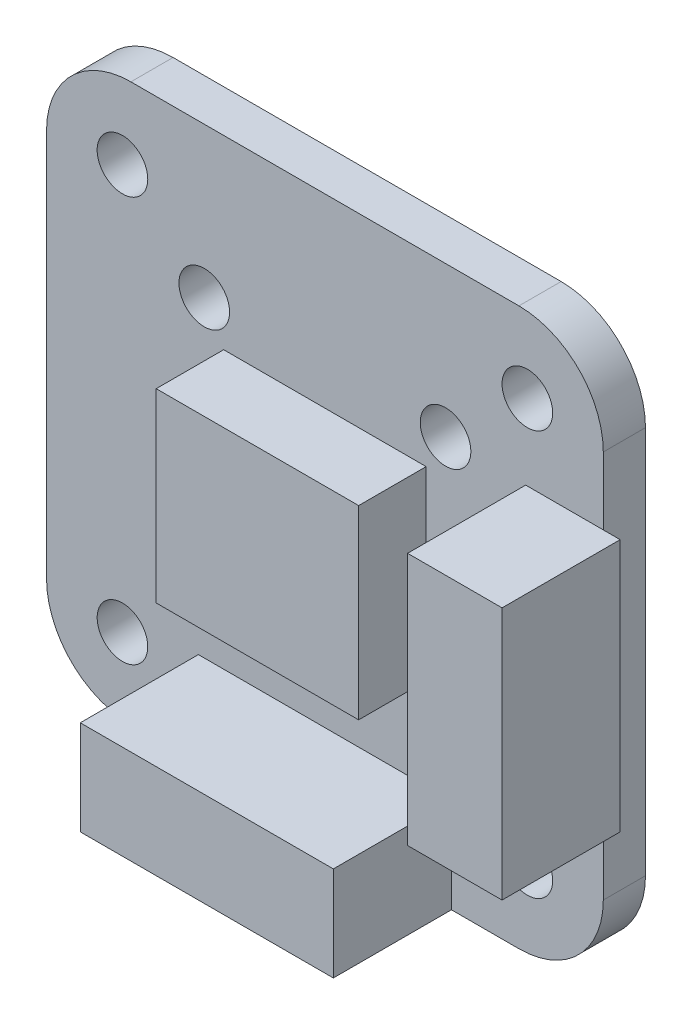
ISO-10303-21;
HEADER;
FILE_DESCRIPTION(('STEP AP214'),'2;1');
FILE_NAME('part.step','',(''),(''),'','','');
FILE_SCHEMA(('AUTOMOTIVE_DESIGN { 1 0 10303 214 1 1 1 1 }'));
ENDSEC;
DATA;
#1=APPLICATION_CONTEXT('core data for automotive mechanical design processes');
#2=APPLICATION_PROTOCOL_DEFINITION('international standard','automotive_design',2000,#1);
#3=PRODUCT_CONTEXT('',#1,'mechanical');
#4=PRODUCT('Part','Part','',(#3));
#5=PRODUCT_RELATED_PRODUCT_CATEGORY('part','',(#4));
#6=PRODUCT_DEFINITION_FORMATION('','',#4);
#7=PRODUCT_DEFINITION_CONTEXT('part definition',#1,'design');
#8=PRODUCT_DEFINITION('design','',#6,#7);
#9=PRODUCT_DEFINITION_SHAPE('','',#8);
#10=(LENGTH_UNIT() NAMED_UNIT(*) SI_UNIT(.MILLI.,.METRE.));
#11=(NAMED_UNIT(*) PLANE_ANGLE_UNIT() SI_UNIT($,.RADIAN.));
#12=(NAMED_UNIT(*) SI_UNIT($,.STERADIAN.) SOLID_ANGLE_UNIT());
#13=UNCERTAINTY_MEASURE_WITH_UNIT(LENGTH_MEASURE(1.E-05),#10,'distance_accuracy_value','');
#14=(GEOMETRIC_REPRESENTATION_CONTEXT(3) GLOBAL_UNCERTAINTY_ASSIGNED_CONTEXT((#13)) GLOBAL_UNIT_ASSIGNED_CONTEXT((#10,
#11,#12)) REPRESENTATION_CONTEXT('',''));
#15=CARTESIAN_POINT('',(0.,0.,0.));
#16=DIRECTION('',(0.,0.,1.));
#17=DIRECTION('',(1.,0.,0.));
#18=AXIS2_PLACEMENT_3D('',#15,#16,#17);
#19=CARTESIAN_POINT('',(0.,0.,2.5));
#20=DIRECTION('',(0.,0.,1.));
#21=DIRECTION('',(1.,0.,0.));
#22=AXIS2_PLACEMENT_3D('',#19,#20,#21);
#23=PLANE('',#22);
#24=CARTESIAN_POINT('',(-10.5917913003579,2.25954198473283,2.5));
#25=DIRECTION('',(0.,0.,1.));
#26=DIRECTION('',(-1.,0.,0.));
#27=AXIS2_PLACEMENT_3D('',#24,#25,#26);
#28=CIRCLE('',#27,1.5);
#29=CARTESIAN_POINT('',(-12.0917913003579,2.25954198473283,2.5));
#30=VERTEX_POINT('',#29);
#31=EDGE_CURVE('E309',#30,#30,#28,.T.);
#32=ORIENTED_EDGE('',*,*,#31,.F.);
#33=EDGE_LOOP('',(#32));
#34=FACE_BOUND('',#33,.T.);
#35=CARTESIAN_POINT('',(-10.5917913003579,-12.9404580152672,2.5));
#36=DIRECTION('',(0.,0.,1.));
#37=DIRECTION('',(1.,0.,0.));
#38=AXIS2_PLACEMENT_3D('',#35,#36,#37);
#39=CIRCLE('',#38,1.5);
#40=CARTESIAN_POINT('',(-9.09179130035786,-12.9404580152672,2.5));
#41=VERTEX_POINT('',#40);
#42=EDGE_CURVE('E325',#41,#41,#39,.T.);
#43=ORIENTED_EDGE('',*,*,#42,.F.);
#44=EDGE_LOOP('',(#43));
#45=FACE_BOUND('',#44,.T.);
#46=CARTESIAN_POINT('',(-15.4417913003579,-17.3404580152672,2.5));
#47=DIRECTION('',(0.,0.,1.));
#48=DIRECTION('',(-1.,0.,0.));
#49=AXIS2_PLACEMENT_3D('',#46,#47,#48);
#50=CIRCLE('',#49,1.5);
#51=CARTESIAN_POINT('',(-16.9417913003579,-17.3404580152672,2.5));
#52=VERTEX_POINT('',#51);
#53=EDGE_CURVE('E341',#52,#52,#50,.T.);
#54=ORIENTED_EDGE('',*,*,#53,.F.);
#55=EDGE_LOOP('',(#54));
#56=FACE_BOUND('',#55,.T.);
#57=CARTESIAN_POINT('',(-15.4417913003579,6.65954198473283,2.5));
#58=DIRECTION('',(0.,0.,1.));
#59=DIRECTION('',(1.,0.,0.));
#60=AXIS2_PLACEMENT_3D('',#57,#58,#59);
#61=CIRCLE('',#60,1.5);
#62=CARTESIAN_POINT('',(-13.9417913003579,6.65954198473283,2.5));
#63=VERTEX_POINT('',#62);
#64=EDGE_CURVE('E357',#63,#63,#61,.T.);
#65=ORIENTED_EDGE('',*,*,#64,.F.);
#66=EDGE_LOOP('',(#65));
#67=FACE_BOUND('',#66,.T.);
#68=CARTESIAN_POINT('',(8.55820869964214,6.65954198473283,2.5));
#69=DIRECTION('',(0.,0.,1.));
#70=DIRECTION('',(-1.,0.,0.));
#71=AXIS2_PLACEMENT_3D('',#68,#69,#70);
#72=CIRCLE('',#71,1.5);
#73=CARTESIAN_POINT('',(7.05820869964214,6.65954198473283,2.5));
#74=VERTEX_POINT('',#73);
#75=EDGE_CURVE('E349',#74,#74,#72,.T.);
#76=ORIENTED_EDGE('',*,*,#75,.F.);
#77=EDGE_LOOP('',(#76));
#78=FACE_BOUND('',#77,.T.);
#79=CARTESIAN_POINT('',(8.55820869964214,-17.3404580152672,2.5));
#80=DIRECTION('',(0.,0.,1.));
#81=DIRECTION('',(1.,0.,0.));
#82=AXIS2_PLACEMENT_3D('',#79,#80,#81);
#83=CIRCLE('',#82,1.5);
#84=CARTESIAN_POINT('',(10.0582086996421,-17.3404580152672,2.5));
#85=VERTEX_POINT('',#84);
#86=EDGE_CURVE('E333',#85,#85,#83,.T.);
#87=ORIENTED_EDGE('',*,*,#86,.F.);
#88=EDGE_LOOP('',(#87));
#89=FACE_BOUND('',#88,.T.);
#90=CARTESIAN_POINT('',(3.70820869964214,-12.9404580152672,2.5));
#91=DIRECTION('',(0.,0.,1.));
#92=DIRECTION('',(-1.,0.,0.));
#93=AXIS2_PLACEMENT_3D('',#90,#91,#92);
#94=CIRCLE('',#93,1.5);
#95=CARTESIAN_POINT('',(2.20820869964214,-12.9404580152672,2.5));
#96=VERTEX_POINT('',#95);
#97=EDGE_CURVE('E317',#96,#96,#94,.T.);
#98=ORIENTED_EDGE('',*,*,#97,.F.);
#99=EDGE_LOOP('',(#98));
#100=FACE_BOUND('',#99,.T.);
#101=CARTESIAN_POINT('',(3.70820869964214,2.25954198473283,2.5));
#102=DIRECTION('',(0.,0.,1.));
#103=DIRECTION('',(1.,0.,0.));
#104=AXIS2_PLACEMENT_3D('',#101,#102,#103);
#105=CIRCLE('',#104,1.5);
#106=CARTESIAN_POINT('',(5.20820869964214,2.25954198473283,2.5));
#107=VERTEX_POINT('',#106);
#108=EDGE_CURVE('E301',#107,#107,#105,.T.);
#109=ORIENTED_EDGE('',*,*,#108,.F.);
#110=EDGE_LOOP('',(#109));
#111=FACE_BOUND('',#110,.T.);
#112=DIRECTION('',(0.,1.,0.));
#113=VECTOR('',#112,1.);
#114=CARTESIAN_POINT('',(13.0582086996421,11.1595419847328,2.5));
#115=LINE('',#114,#113);
#116=CARTESIAN_POINT('',(13.0582086996421,-16.8404580152672,2.5));
#117=VERTEX_POINT('',#116);
#118=CARTESIAN_POINT('',(13.0582086996421,-12.8404580152672,2.5));
#119=VERTEX_POINT('',#118);
#120=EDGE_CURVE('E375',#117,#119,#115,.T.);
#121=ORIENTED_EDGE('',*,*,#120,.T.);
#122=DIRECTION('',(1.,0.,0.));
#123=VECTOR('',#122,1.);
#124=CARTESIAN_POINT('',(8.45820869964214,-12.8404580152672,2.5));
#125=LINE('',#124,#123);
#126=CARTESIAN_POINT('',(8.45820869964214,-12.8404580152672,2.5));
#127=VERTEX_POINT('',#126);
#128=EDGE_CURVE('E63',#127,#119,#125,.T.);
#129=ORIENTED_EDGE('',*,*,#128,.F.);
#130=DIRECTION('',(0.,-1.,0.));
#131=VECTOR('',#130,1.);
#132=CARTESIAN_POINT('',(8.45820869964214,2.15954198473282,2.5));
#133=LINE('',#132,#131);
#134=CARTESIAN_POINT('',(8.45820869964214,2.15954198473282,2.5));
#135=VERTEX_POINT('',#134);
#136=EDGE_CURVE('E211',#135,#127,#133,.T.);
#137=ORIENTED_EDGE('',*,*,#136,.F.);
#138=DIRECTION('',(-1.,0.,0.));
#139=VECTOR('',#138,1.);
#140=CARTESIAN_POINT('',(8.45820869964214,2.15954198473282,2.5));
#141=LINE('',#140,#139);
#142=CARTESIAN_POINT('',(13.0582086996421,2.15954198473282,2.5));
#143=VERTEX_POINT('',#142);
#144=EDGE_CURVE('E241',#143,#135,#141,.T.);
#145=ORIENTED_EDGE('',*,*,#144,.F.);
#146=CARTESIAN_POINT('',(13.0582086996421,6.15954198473282,2.5));
#147=VERTEX_POINT('',#146);
#148=EDGE_CURVE('E374',#143,#147,#115,.T.);
#149=ORIENTED_EDGE('',*,*,#148,.T.);
#150=CARTESIAN_POINT('',(8.05820869964214,6.15954198473282,2.5));
#151=DIRECTION('',(0.,0.,1.));
#152=DIRECTION('',(1.,0.,0.));
#153=AXIS2_PLACEMENT_3D('',#150,#151,#152);
#154=CIRCLE('',#153,5.);
#155=CARTESIAN_POINT('',(8.05820869964214,11.1595419847328,2.5));
#156=VERTEX_POINT('',#155);
#157=EDGE_CURVE('E425',#147,#156,#154,.T.);
#158=ORIENTED_EDGE('',*,*,#157,.T.);
#159=DIRECTION('',(-1.,0.,0.));
#160=VECTOR('',#159,1.);
#161=CARTESIAN_POINT('',(-19.9417913003579,11.1595419847328,2.5));
#162=LINE('',#161,#160);
#163=CARTESIAN_POINT('',(-14.9417913003579,11.1595419847328,2.5));
#164=VERTEX_POINT('',#163);
#165=EDGE_CURVE('E378',#156,#164,#162,.T.);
#166=ORIENTED_EDGE('',*,*,#165,.T.);
#167=CARTESIAN_POINT('',(-14.9417913003579,6.15954198473282,2.5));
#168=DIRECTION('',(0.,0.,1.));
#169=DIRECTION('',(1.,0.,0.));
#170=AXIS2_PLACEMENT_3D('',#167,#168,#169);
#171=CIRCLE('',#170,5.);
#172=CARTESIAN_POINT('',(-19.9417913003579,6.15954198473282,2.5));
#173=VERTEX_POINT('',#172);
#174=EDGE_CURVE('E428',#164,#173,#171,.T.);
#175=ORIENTED_EDGE('',*,*,#174,.T.);
#176=DIRECTION('',(0.,-1.,0.));
#177=VECTOR('',#176,1.);
#178=CARTESIAN_POINT('',(-19.9417913003579,11.1595419847328,2.5));
#179=LINE('',#178,#177);
#180=CARTESIAN_POINT('',(-19.9417913003579,-16.8404580152672,2.5));
#181=VERTEX_POINT('',#180);
#182=EDGE_CURVE('E365',#173,#181,#179,.T.);
#183=ORIENTED_EDGE('',*,*,#182,.T.);
#184=CARTESIAN_POINT('',(-14.9417913003579,-16.8404580152672,2.5));
#185=DIRECTION('',(0.,0.,1.));
#186=DIRECTION('',(1.,0.,0.));
#187=AXIS2_PLACEMENT_3D('',#184,#185,#186);
#188=CIRCLE('',#187,5.);
#189=CARTESIAN_POINT('',(-14.9417913003579,-21.8404580152672,2.5));
#190=VERTEX_POINT('',#189);
#191=EDGE_CURVE('E431',#181,#190,#188,.T.);
#192=ORIENTED_EDGE('',*,*,#191,.T.);
#193=DIRECTION('',(1.,0.,0.));
#194=VECTOR('',#193,1.);
#195=CARTESIAN_POINT('',(-19.9417913003579,-21.8404580152672,2.5));
#196=LINE('',#195,#194);
#197=CARTESIAN_POINT('',(-10.9417913003579,-21.8404580152672,2.5));
#198=VERTEX_POINT('',#197);
#199=EDGE_CURVE('E371',#190,#198,#196,.T.);
#200=ORIENTED_EDGE('',*,*,#199,.T.);
#201=DIRECTION('',(0.,-1.,0.));
#202=VECTOR('',#201,1.);
#203=CARTESIAN_POINT('',(-10.9417913003579,-16.2404580152672,2.5));
#204=LINE('',#203,#202);
#205=CARTESIAN_POINT('',(-10.9417913003579,-16.2404580152672,2.5));
#206=VERTEX_POINT('',#205);
#207=EDGE_CURVE('E259',#206,#198,#204,.T.);
#208=ORIENTED_EDGE('',*,*,#207,.F.);
#209=DIRECTION('',(-1.,0.,0.));
#210=VECTOR('',#209,1.);
#211=CARTESIAN_POINT('',(-10.9417913003579,-16.2404580152672,2.5));
#212=LINE('',#211,#210);
#213=CARTESIAN_POINT('',(4.05820869964214,-16.2404580152672,2.5));
#214=VERTEX_POINT('',#213);
#215=EDGE_CURVE('E265',#214,#206,#212,.T.);
#216=ORIENTED_EDGE('',*,*,#215,.F.);
#217=DIRECTION('',(0.,1.,0.));
#218=VECTOR('',#217,1.);
#219=CARTESIAN_POINT('',(4.05820869964214,-16.2404580152672,2.5));
#220=LINE('',#219,#218);
#221=CARTESIAN_POINT('',(4.05820869964214,-21.8404580152672,2.5));
#222=VERTEX_POINT('',#221);
#223=EDGE_CURVE('E278',#222,#214,#220,.T.);
#224=ORIENTED_EDGE('',*,*,#223,.F.);
#225=CARTESIAN_POINT('',(8.05820869964214,-21.8404580152672,2.5));
#226=VERTEX_POINT('',#225);
#227=EDGE_CURVE('E369',#222,#226,#196,.T.);
#228=ORIENTED_EDGE('',*,*,#227,.T.);
#229=CARTESIAN_POINT('',(8.05820869964214,-16.8404580152672,2.5));
#230=DIRECTION('',(0.,0.,1.));
#231=DIRECTION('',(1.,0.,0.));
#232=AXIS2_PLACEMENT_3D('',#229,#230,#231);
#233=CIRCLE('',#232,5.);
#234=EDGE_CURVE('E434',#226,#117,#233,.T.);
#235=ORIENTED_EDGE('',*,*,#234,.T.);
#236=EDGE_LOOP('',(#121,#129,#137,#145,#149,#158,#166,#175,#183,#192,#200,#208,#216,#224,#228,#235));
#237=FACE_BOUND('',#236,.T.);
#238=DIRECTION('',(1.,0.,0.));
#239=VECTOR('',#238,1.);
#240=CARTESIAN_POINT('',(-9.44179130035786,-10.8404580152672,2.5));
#241=LINE('',#240,#239);
#242=CARTESIAN_POINT('',(-9.44179130035786,-10.8404580152672,2.5));
#243=VERTEX_POINT('',#242);
#244=CARTESIAN_POINT('',(2.55820869964214,-10.8404580152672,2.5));
#245=VERTEX_POINT('',#244);
#246=EDGE_CURVE('E851',#243,#245,#241,.T.);
#247=ORIENTED_EDGE('',*,*,#246,.F.);
#248=DIRECTION('',(0.,-1.,0.));
#249=VECTOR('',#248,1.);
#250=CARTESIAN_POINT('',(-9.44179130035786,0.159541984732824,2.5));
#251=LINE('',#250,#249);
#252=CARTESIAN_POINT('',(-9.44179130035786,0.159541984732824,2.5));
#253=VERTEX_POINT('',#252);
#254=EDGE_CURVE('E208',#253,#243,#251,.T.);
#255=ORIENTED_EDGE('',*,*,#254,.F.);
#256=DIRECTION('',(-1.,0.,0.));
#257=VECTOR('',#256,1.);
#258=CARTESIAN_POINT('',(-9.44179130035786,0.159541984732824,2.5));
#259=LINE('',#258,#257);
#260=CARTESIAN_POINT('',(2.55820869964214,0.159541984732825,2.5));
#261=VERTEX_POINT('',#260);
#262=EDGE_CURVE('E204',#261,#253,#259,.T.);
#263=ORIENTED_EDGE('',*,*,#262,.F.);
#264=DIRECTION('',(0.,1.,0.));
#265=VECTOR('',#264,1.);
#266=CARTESIAN_POINT('',(2.55820869964214,0.159541984732825,2.5));
#267=LINE('',#266,#265);
#268=EDGE_CURVE('E847',#245,#261,#267,.T.);
#269=ORIENTED_EDGE('',*,*,#268,.F.);
#270=EDGE_LOOP('',(#247,#255,#263,#269));
#271=FACE_BOUND('',#270,.T.);
#272=ADVANCED_FACE('F39',(#34,#45,#56,#67,#78,#89,#100,#111,#237,#271),#23,.T.);
#273=CARTESIAN_POINT('',(0.,0.,0.));
#274=DIRECTION('',(0.,0.,1.));
#275=DIRECTION('',(1.,0.,0.));
#276=AXIS2_PLACEMENT_3D('',#273,#274,#275);
#277=PLANE('',#276);
#278=DIRECTION('',(0.,1.,0.));
#279=VECTOR('',#278,1.);
#280=CARTESIAN_POINT('',(13.0582086996421,11.1595419847328,0.));
#281=LINE('',#280,#279);
#282=CARTESIAN_POINT('',(13.0582086996421,-16.8404580152672,0.));
#283=VERTEX_POINT('',#282);
#284=CARTESIAN_POINT('',(13.0582086996421,6.15954198473282,0.));
#285=VERTEX_POINT('',#284);
#286=EDGE_CURVE('E391',#283,#285,#281,.T.);
#287=ORIENTED_EDGE('',*,*,#286,.F.);
#288=CARTESIAN_POINT('',(8.05820869964214,-16.8404580152672,0.));
#289=DIRECTION('',(0.,0.,1.));
#290=DIRECTION('',(1.,0.,0.));
#291=AXIS2_PLACEMENT_3D('',#288,#289,#290);
#292=CIRCLE('',#291,5.);
#293=CARTESIAN_POINT('',(8.05820869964214,-21.8404580152672,0.));
#294=VERTEX_POINT('',#293);
#295=EDGE_CURVE('E414',#283,#294,#292,.F.);
#296=ORIENTED_EDGE('',*,*,#295,.T.);
#297=DIRECTION('',(1.,0.,0.));
#298=VECTOR('',#297,1.);
#299=CARTESIAN_POINT('',(-19.9417913003579,-21.8404580152672,0.));
#300=LINE('',#299,#298);
#301=CARTESIAN_POINT('',(-14.9417913003579,-21.8404580152672,0.));
#302=VERTEX_POINT('',#301);
#303=EDGE_CURVE('E387',#302,#294,#300,.T.);
#304=ORIENTED_EDGE('',*,*,#303,.F.);
#305=CARTESIAN_POINT('',(-14.9417913003579,-16.8404580152672,0.));
#306=DIRECTION('',(0.,0.,1.));
#307=DIRECTION('',(1.,0.,0.));
#308=AXIS2_PLACEMENT_3D('',#305,#306,#307);
#309=CIRCLE('',#308,5.);
#310=CARTESIAN_POINT('',(-19.9417913003579,-16.8404580152672,0.));
#311=VERTEX_POINT('',#310);
#312=EDGE_CURVE('E411',#302,#311,#309,.F.);
#313=ORIENTED_EDGE('',*,*,#312,.T.);
#314=DIRECTION('',(0.,-1.,0.));
#315=VECTOR('',#314,1.);
#316=CARTESIAN_POINT('',(-19.9417913003579,11.1595419847328,0.));
#317=LINE('',#316,#315);
#318=CARTESIAN_POINT('',(-19.9417913003579,6.15954198473282,0.));
#319=VERTEX_POINT('',#318);
#320=EDGE_CURVE('E361',#319,#311,#317,.T.);
#321=ORIENTED_EDGE('',*,*,#320,.F.);
#322=CARTESIAN_POINT('',(-14.9417913003579,6.15954198473282,0.));
#323=DIRECTION('',(0.,0.,1.));
#324=DIRECTION('',(1.,0.,0.));
#325=AXIS2_PLACEMENT_3D('',#322,#323,#324);
#326=CIRCLE('',#325,5.);
#327=CARTESIAN_POINT('',(-14.9417913003579,11.1595419847328,0.));
#328=VERTEX_POINT('',#327);
#329=EDGE_CURVE('E408',#319,#328,#326,.F.);
#330=ORIENTED_EDGE('',*,*,#329,.T.);
#331=DIRECTION('',(-1.,0.,0.));
#332=VECTOR('',#331,1.);
#333=CARTESIAN_POINT('',(-19.9417913003579,11.1595419847328,0.));
#334=LINE('',#333,#332);
#335=CARTESIAN_POINT('',(8.05820869964214,11.1595419847328,0.));
#336=VERTEX_POINT('',#335);
#337=EDGE_CURVE('E370',#336,#328,#334,.T.);
#338=ORIENTED_EDGE('',*,*,#337,.F.);
#339=CARTESIAN_POINT('',(8.05820869964214,6.15954198473282,0.));
#340=DIRECTION('',(0.,0.,1.));
#341=DIRECTION('',(1.,0.,0.));
#342=AXIS2_PLACEMENT_3D('',#339,#340,#341);
#343=CIRCLE('',#342,5.);
#344=EDGE_CURVE('E405',#336,#285,#343,.F.);
#345=ORIENTED_EDGE('',*,*,#344,.T.);
#346=EDGE_LOOP('',(#287,#296,#304,#313,#321,#330,#338,#345));
#347=FACE_BOUND('',#346,.T.);
#348=CARTESIAN_POINT('',(-15.4417913003579,6.65954198473283,0.));
#349=DIRECTION('',(0.,0.,1.));
#350=DIRECTION('',(1.,0.,0.));
#351=AXIS2_PLACEMENT_3D('',#348,#349,#350);
#352=CIRCLE('',#351,1.5);
#353=CARTESIAN_POINT('',(-13.9417913003579,6.65954198473283,0.));
#354=VERTEX_POINT('',#353);
#355=EDGE_CURVE('E353',#354,#354,#352,.T.);
#356=ORIENTED_EDGE('',*,*,#355,.T.);
#357=EDGE_LOOP('',(#356));
#358=FACE_BOUND('',#357,.T.);
#359=CARTESIAN_POINT('',(8.55820869964214,6.65954198473283,0.));
#360=DIRECTION('',(0.,0.,1.));
#361=DIRECTION('',(-1.,0.,0.));
#362=AXIS2_PLACEMENT_3D('',#359,#360,#361);
#363=CIRCLE('',#362,1.5);
#364=CARTESIAN_POINT('',(7.05820869964214,6.65954198473283,0.));
#365=VERTEX_POINT('',#364);
#366=EDGE_CURVE('E345',#365,#365,#363,.T.);
#367=ORIENTED_EDGE('',*,*,#366,.T.);
#368=EDGE_LOOP('',(#367));
#369=FACE_BOUND('',#368,.T.);
#370=CARTESIAN_POINT('',(-15.4417913003579,-17.3404580152672,0.));
#371=DIRECTION('',(0.,0.,1.));
#372=DIRECTION('',(-1.,0.,0.));
#373=AXIS2_PLACEMENT_3D('',#370,#371,#372);
#374=CIRCLE('',#373,1.5);
#375=CARTESIAN_POINT('',(-16.9417913003579,-17.3404580152672,0.));
#376=VERTEX_POINT('',#375);
#377=EDGE_CURVE('E337',#376,#376,#374,.T.);
#378=ORIENTED_EDGE('',*,*,#377,.T.);
#379=EDGE_LOOP('',(#378));
#380=FACE_BOUND('',#379,.T.);
#381=CARTESIAN_POINT('',(8.55820869964214,-17.3404580152672,0.));
#382=DIRECTION('',(0.,0.,1.));
#383=DIRECTION('',(1.,0.,0.));
#384=AXIS2_PLACEMENT_3D('',#381,#382,#383);
#385=CIRCLE('',#384,1.5);
#386=CARTESIAN_POINT('',(10.0582086996421,-17.3404580152672,0.));
#387=VERTEX_POINT('',#386);
#388=EDGE_CURVE('E329',#387,#387,#385,.T.);
#389=ORIENTED_EDGE('',*,*,#388,.T.);
#390=EDGE_LOOP('',(#389));
#391=FACE_BOUND('',#390,.T.);
#392=CARTESIAN_POINT('',(-10.5917913003579,-12.9404580152672,0.));
#393=DIRECTION('',(0.,0.,1.));
#394=DIRECTION('',(1.,0.,0.));
#395=AXIS2_PLACEMENT_3D('',#392,#393,#394);
#396=CIRCLE('',#395,1.5);
#397=CARTESIAN_POINT('',(-9.09179130035786,-12.9404580152672,0.));
#398=VERTEX_POINT('',#397);
#399=EDGE_CURVE('E321',#398,#398,#396,.T.);
#400=ORIENTED_EDGE('',*,*,#399,.T.);
#401=EDGE_LOOP('',(#400));
#402=FACE_BOUND('',#401,.T.);
#403=CARTESIAN_POINT('',(3.70820869964214,-12.9404580152672,0.));
#404=DIRECTION('',(0.,0.,1.));
#405=DIRECTION('',(-1.,0.,0.));
#406=AXIS2_PLACEMENT_3D('',#403,#404,#405);
#407=CIRCLE('',#406,1.5);
#408=CARTESIAN_POINT('',(2.20820869964214,-12.9404580152672,0.));
#409=VERTEX_POINT('',#408);
#410=EDGE_CURVE('E313',#409,#409,#407,.T.);
#411=ORIENTED_EDGE('',*,*,#410,.T.);
#412=EDGE_LOOP('',(#411));
#413=FACE_BOUND('',#412,.T.);
#414=CARTESIAN_POINT('',(-10.5917913003579,2.25954198473283,0.));
#415=DIRECTION('',(0.,0.,1.));
#416=DIRECTION('',(-1.,0.,0.));
#417=AXIS2_PLACEMENT_3D('',#414,#415,#416);
#418=CIRCLE('',#417,1.5);
#419=CARTESIAN_POINT('',(-12.0917913003579,2.25954198473283,0.));
#420=VERTEX_POINT('',#419);
#421=EDGE_CURVE('E305',#420,#420,#418,.T.);
#422=ORIENTED_EDGE('',*,*,#421,.T.);
#423=EDGE_LOOP('',(#422));
#424=FACE_BOUND('',#423,.T.);
#425=CARTESIAN_POINT('',(3.70820869964214,2.25954198473283,0.));
#426=DIRECTION('',(0.,0.,1.));
#427=DIRECTION('',(1.,0.,0.));
#428=AXIS2_PLACEMENT_3D('',#425,#426,#427);
#429=CIRCLE('',#428,1.5);
#430=CARTESIAN_POINT('',(5.20820869964214,2.25954198473283,0.));
#431=VERTEX_POINT('',#430);
#432=EDGE_CURVE('E300',#431,#431,#429,.T.);
#433=ORIENTED_EDGE('',*,*,#432,.T.);
#434=EDGE_LOOP('',(#433));
#435=FACE_BOUND('',#434,.T.);
#436=ADVANCED_FACE('F455',(#347,#358,#369,#380,#391,#402,#413,#424,#435),#277,.F.);
#437=CARTESIAN_POINT('',(-19.9417913003579,11.1595419847328,2.5));
#438=DIRECTION('',(1.,0.,0.));
#439=DIRECTION('',(0.,0.,-1.));
#440=AXIS2_PLACEMENT_3D('',#437,#438,#439);
#441=PLANE('',#440);
#442=ORIENTED_EDGE('',*,*,#320,.T.);
#443=DIRECTION('',(0.,0.,-1.));
#444=VECTOR('',#443,1.);
#445=CARTESIAN_POINT('',(-19.9417913003579,-16.8404580152672,2.5));
#446=LINE('',#445,#444);
#447=EDGE_CURVE('E441',#311,#181,#446,.F.);
#448=ORIENTED_EDGE('',*,*,#447,.T.);
#449=ORIENTED_EDGE('',*,*,#182,.F.);
#450=DIRECTION('',(0.,0.,-1.));
#451=VECTOR('',#450,1.);
#452=CARTESIAN_POINT('',(-19.9417913003579,6.15954198473282,2.5));
#453=LINE('',#452,#451);
#454=EDGE_CURVE('E437',#173,#319,#453,.T.);
#455=ORIENTED_EDGE('',*,*,#454,.T.);
#456=EDGE_LOOP('',(#442,#448,#449,#455));
#457=FACE_BOUND('',#456,.T.);
#458=ADVANCED_FACE('F464',(#457),#441,.F.);
#459=CARTESIAN_POINT('',(-19.9417913003579,-21.8404580152672,2.5));
#460=DIRECTION('',(0.,1.,0.));
#461=DIRECTION('',(0.,0.,1.));
#462=AXIS2_PLACEMENT_3D('',#459,#460,#461);
#463=PLANE('',#462);
#464=ORIENTED_EDGE('',*,*,#303,.T.);
#465=DIRECTION('',(0.,0.,-1.));
#466=VECTOR('',#465,1.);
#467=CARTESIAN_POINT('',(8.05820869964214,-21.8404580152672,2.5));
#468=LINE('',#467,#466);
#469=EDGE_CURVE('E421',#294,#226,#468,.F.);
#470=ORIENTED_EDGE('',*,*,#469,.T.);
#471=ORIENTED_EDGE('',*,*,#227,.F.);
#472=DIRECTION('',(0.,0.,-1.));
#473=VECTOR('',#472,1.);
#474=CARTESIAN_POINT('',(4.05820869964214,-21.8404580152672,9.5));
#475=LINE('',#474,#473);
#476=CARTESIAN_POINT('',(4.05820869964214,-21.8404580152672,9.5));
#477=VERTEX_POINT('',#476);
#478=EDGE_CURVE('E292',#477,#222,#475,.T.);
#479=ORIENTED_EDGE('',*,*,#478,.F.);
#480=DIRECTION('',(1.,0.,0.));
#481=VECTOR('',#480,1.);
#482=CARTESIAN_POINT('',(-10.9417913003579,-21.8404580152672,9.5));
#483=LINE('',#482,#481);
#484=CARTESIAN_POINT('',(-10.9417913003579,-21.8404580152672,9.5));
#485=VERTEX_POINT('',#484);
#486=EDGE_CURVE('E264',#485,#477,#483,.T.);
#487=ORIENTED_EDGE('',*,*,#486,.F.);
#488=DIRECTION('',(0.,0.,-1.));
#489=VECTOR('',#488,1.);
#490=CARTESIAN_POINT('',(-10.9417913003579,-21.8404580152672,9.5));
#491=LINE('',#490,#489);
#492=EDGE_CURVE('E296',#485,#198,#491,.T.);
#493=ORIENTED_EDGE('',*,*,#492,.T.);
#494=ORIENTED_EDGE('',*,*,#199,.F.);
#495=DIRECTION('',(0.,0.,-1.));
#496=VECTOR('',#495,1.);
#497=CARTESIAN_POINT('',(-14.9417913003579,-21.8404580152672,2.5));
#498=LINE('',#497,#496);
#499=EDGE_CURVE('E417',#190,#302,#498,.T.);
#500=ORIENTED_EDGE('',*,*,#499,.T.);
#501=EDGE_LOOP('',(#464,#470,#471,#479,#487,#493,#494,#500));
#502=FACE_BOUND('',#501,.T.);
#503=ADVANCED_FACE('F474',(#502),#463,.F.);
#504=CARTESIAN_POINT('',(13.0582086996421,11.1595419847328,2.5));
#505=DIRECTION('',(-1.,0.,0.));
#506=DIRECTION('',(0.,0.,1.));
#507=AXIS2_PLACEMENT_3D('',#504,#505,#506);
#508=PLANE('',#507);
#509=ORIENTED_EDGE('',*,*,#120,.F.);
#510=DIRECTION('',(0.,0.,-1.));
#511=VECTOR('',#510,1.);
#512=CARTESIAN_POINT('',(13.0582086996421,-16.8404580152672,2.5));
#513=LINE('',#512,#511);
#514=EDGE_CURVE('E401',#117,#283,#513,.T.);
#515=ORIENTED_EDGE('',*,*,#514,.T.);
#516=ORIENTED_EDGE('',*,*,#286,.T.);
#517=DIRECTION('',(0.,0.,-1.));
#518=VECTOR('',#517,1.);
#519=CARTESIAN_POINT('',(13.0582086996421,6.15954198473282,2.5));
#520=LINE('',#519,#518);
#521=EDGE_CURVE('E383',#285,#147,#520,.F.);
#522=ORIENTED_EDGE('',*,*,#521,.T.);
#523=ORIENTED_EDGE('',*,*,#148,.F.);
#524=EDGE_CURVE('E379',#119,#143,#115,.T.);
#525=ORIENTED_EDGE('',*,*,#524,.F.);
#526=EDGE_LOOP('',(#509,#515,#516,#522,#523,#525));
#527=FACE_BOUND('',#526,.T.);
#528=ADVANCED_FACE('F482',(#527),#508,.F.);
#529=CARTESIAN_POINT('',(-19.9417913003579,11.1595419847328,2.5));
#530=DIRECTION('',(0.,-1.,0.));
#531=DIRECTION('',(0.,0.,-1.));
#532=AXIS2_PLACEMENT_3D('',#529,#530,#531);
#533=PLANE('',#532);
#534=ORIENTED_EDGE('',*,*,#337,.T.);
#535=DIRECTION('',(0.,0.,-1.));
#536=VECTOR('',#535,1.);
#537=CARTESIAN_POINT('',(-14.9417913003579,11.1595419847328,2.5));
#538=LINE('',#537,#536);
#539=EDGE_CURVE('E11',#328,#164,#538,.F.);
#540=ORIENTED_EDGE('',*,*,#539,.T.);
#541=ORIENTED_EDGE('',*,*,#165,.F.);
#542=DIRECTION('',(0.,0.,-1.));
#543=VECTOR('',#542,1.);
#544=CARTESIAN_POINT('',(8.05820869964214,11.1595419847328,2.5));
#545=LINE('',#544,#543);
#546=EDGE_CURVE('E48',#156,#336,#545,.T.);
#547=ORIENTED_EDGE('',*,*,#546,.T.);
#548=EDGE_LOOP('',(#534,#540,#541,#547));
#549=FACE_BOUND('',#548,.T.);
#550=ADVANCED_FACE('F449',(#549),#533,.F.);
#551=CARTESIAN_POINT('',(-15.4417913003579,6.65954198473283,2.5));
#552=DIRECTION('',(0.,0.,-1.));
#553=DIRECTION('',(-1.,0.,0.));
#554=AXIS2_PLACEMENT_3D('',#551,#552,#553);
#555=CYLINDRICAL_SURFACE('',#554,1.5);
#556=ORIENTED_EDGE('',*,*,#64,.T.);
#557=EDGE_LOOP('',(#556));
#558=FACE_BOUND('',#557,.T.);
#559=ORIENTED_EDGE('',*,*,#355,.F.);
#560=EDGE_LOOP('',(#559));
#561=FACE_BOUND('',#560,.T.);
#562=ADVANCED_FACE('F527',(#558,#561),#555,.F.);
#563=CARTESIAN_POINT('',(8.55820869964214,6.65954198473283,2.5));
#564=DIRECTION('',(0.,0.,-1.));
#565=DIRECTION('',(-1.,0.,0.));
#566=AXIS2_PLACEMENT_3D('',#563,#564,#565);
#567=CYLINDRICAL_SURFACE('',#566,1.5);
#568=ORIENTED_EDGE('',*,*,#75,.T.);
#569=EDGE_LOOP('',(#568));
#570=FACE_BOUND('',#569,.T.);
#571=ORIENTED_EDGE('',*,*,#366,.F.);
#572=EDGE_LOOP('',(#571));
#573=FACE_BOUND('',#572,.T.);
#574=ADVANCED_FACE('F728',(#570,#573),#567,.F.);
#575=CARTESIAN_POINT('',(-15.4417913003579,-17.3404580152672,2.5));
#576=DIRECTION('',(0.,0.,-1.));
#577=DIRECTION('',(-1.,0.,0.));
#578=AXIS2_PLACEMENT_3D('',#575,#576,#577);
#579=CYLINDRICAL_SURFACE('',#578,1.5);
#580=ORIENTED_EDGE('',*,*,#53,.T.);
#581=EDGE_LOOP('',(#580));
#582=FACE_BOUND('',#581,.T.);
#583=ORIENTED_EDGE('',*,*,#377,.F.);
#584=EDGE_LOOP('',(#583));
#585=FACE_BOUND('',#584,.T.);
#586=ADVANCED_FACE('F725',(#582,#585),#579,.F.);
#587=CARTESIAN_POINT('',(8.55820869964214,-17.3404580152672,2.5));
#588=DIRECTION('',(0.,0.,-1.));
#589=DIRECTION('',(-1.,0.,0.));
#590=AXIS2_PLACEMENT_3D('',#587,#588,#589);
#591=CYLINDRICAL_SURFACE('',#590,1.5);
#592=ORIENTED_EDGE('',*,*,#86,.T.);
#593=EDGE_LOOP('',(#592));
#594=FACE_BOUND('',#593,.T.);
#595=ORIENTED_EDGE('',*,*,#388,.F.);
#596=EDGE_LOOP('',(#595));
#597=FACE_BOUND('',#596,.T.);
#598=ADVANCED_FACE('F721',(#594,#597),#591,.F.);
#599=CARTESIAN_POINT('',(-10.5917913003579,-12.9404580152672,2.5));
#600=DIRECTION('',(0.,0.,-1.));
#601=DIRECTION('',(-1.,0.,0.));
#602=AXIS2_PLACEMENT_3D('',#599,#600,#601);
#603=CYLINDRICAL_SURFACE('',#602,1.5);
#604=ORIENTED_EDGE('',*,*,#42,.T.);
#605=EDGE_LOOP('',(#604));
#606=FACE_BOUND('',#605,.T.);
#607=ORIENTED_EDGE('',*,*,#399,.F.);
#608=EDGE_LOOP('',(#607));
#609=FACE_BOUND('',#608,.T.);
#610=ADVANCED_FACE('F717',(#606,#609),#603,.F.);
#611=CARTESIAN_POINT('',(3.70820869964214,-12.9404580152672,2.5));
#612=DIRECTION('',(0.,0.,-1.));
#613=DIRECTION('',(-1.,0.,0.));
#614=AXIS2_PLACEMENT_3D('',#611,#612,#613);
#615=CYLINDRICAL_SURFACE('',#614,1.5);
#616=ORIENTED_EDGE('',*,*,#97,.T.);
#617=EDGE_LOOP('',(#616));
#618=FACE_BOUND('',#617,.T.);
#619=ORIENTED_EDGE('',*,*,#410,.F.);
#620=EDGE_LOOP('',(#619));
#621=FACE_BOUND('',#620,.T.);
#622=ADVANCED_FACE('F713',(#618,#621),#615,.F.);
#623=CARTESIAN_POINT('',(-10.5917913003579,2.25954198473283,2.5));
#624=DIRECTION('',(0.,0.,-1.));
#625=DIRECTION('',(-1.,0.,0.));
#626=AXIS2_PLACEMENT_3D('',#623,#624,#625);
#627=CYLINDRICAL_SURFACE('',#626,1.5);
#628=ORIENTED_EDGE('',*,*,#31,.T.);
#629=EDGE_LOOP('',(#628));
#630=FACE_BOUND('',#629,.T.);
#631=ORIENTED_EDGE('',*,*,#421,.F.);
#632=EDGE_LOOP('',(#631));
#633=FACE_BOUND('',#632,.T.);
#634=ADVANCED_FACE('F709',(#630,#633),#627,.F.);
#635=CARTESIAN_POINT('',(3.70820869964214,2.25954198473283,2.5));
#636=DIRECTION('',(0.,0.,-1.));
#637=DIRECTION('',(-1.,0.,0.));
#638=AXIS2_PLACEMENT_3D('',#635,#636,#637);
#639=CYLINDRICAL_SURFACE('',#638,1.5);
#640=ORIENTED_EDGE('',*,*,#108,.T.);
#641=EDGE_LOOP('',(#640));
#642=FACE_BOUND('',#641,.T.);
#643=ORIENTED_EDGE('',*,*,#432,.F.);
#644=EDGE_LOOP('',(#643));
#645=FACE_BOUND('',#644,.T.);
#646=ADVANCED_FACE('F540',(#642,#645),#639,.F.);
#647=CARTESIAN_POINT('',(8.05820869964214,-16.8404580152672,2.5));
#648=DIRECTION('',(0.,0.,-1.));
#649=DIRECTION('',(-1.,0.,0.));
#650=AXIS2_PLACEMENT_3D('',#647,#648,#649);
#651=CYLINDRICAL_SURFACE('',#650,5.);
#652=ORIENTED_EDGE('',*,*,#234,.F.);
#653=ORIENTED_EDGE('',*,*,#469,.F.);
#654=ORIENTED_EDGE('',*,*,#295,.F.);
#655=ORIENTED_EDGE('',*,*,#514,.F.);
#656=EDGE_LOOP('',(#652,#653,#654,#655));
#657=FACE_BOUND('',#656,.T.);
#658=ADVANCED_FACE('F479',(#657),#651,.T.);
#659=CARTESIAN_POINT('',(-14.9417913003579,-16.8404580152672,2.5));
#660=DIRECTION('',(0.,0.,-1.));
#661=DIRECTION('',(-1.,0.,0.));
#662=AXIS2_PLACEMENT_3D('',#659,#660,#661);
#663=CYLINDRICAL_SURFACE('',#662,5.);
#664=ORIENTED_EDGE('',*,*,#191,.F.);
#665=ORIENTED_EDGE('',*,*,#447,.F.);
#666=ORIENTED_EDGE('',*,*,#312,.F.);
#667=ORIENTED_EDGE('',*,*,#499,.F.);
#668=EDGE_LOOP('',(#664,#665,#666,#667));
#669=FACE_BOUND('',#668,.T.);
#670=ADVANCED_FACE('F471',(#669),#663,.T.);
#671=CARTESIAN_POINT('',(-14.9417913003579,6.15954198473282,2.5));
#672=DIRECTION('',(0.,0.,-1.));
#673=DIRECTION('',(-1.,0.,0.));
#674=AXIS2_PLACEMENT_3D('',#671,#672,#673);
#675=CYLINDRICAL_SURFACE('',#674,5.);
#676=ORIENTED_EDGE('',*,*,#174,.F.);
#677=ORIENTED_EDGE('',*,*,#539,.F.);
#678=ORIENTED_EDGE('',*,*,#329,.F.);
#679=ORIENTED_EDGE('',*,*,#454,.F.);
#680=EDGE_LOOP('',(#676,#677,#678,#679));
#681=FACE_BOUND('',#680,.T.);
#682=ADVANCED_FACE('F461',(#681),#675,.T.);
#683=CARTESIAN_POINT('',(8.05820869964214,6.15954198473282,2.5));
#684=DIRECTION('',(0.,0.,-1.));
#685=DIRECTION('',(-1.,0.,0.));
#686=AXIS2_PLACEMENT_3D('',#683,#684,#685);
#687=CYLINDRICAL_SURFACE('',#686,5.);
#688=ORIENTED_EDGE('',*,*,#157,.F.);
#689=ORIENTED_EDGE('',*,*,#521,.F.);
#690=ORIENTED_EDGE('',*,*,#344,.F.);
#691=ORIENTED_EDGE('',*,*,#546,.F.);
#692=EDGE_LOOP('',(#688,#689,#690,#691));
#693=FACE_BOUND('',#692,.T.);
#694=ADVANCED_FACE('F41',(#693),#687,.T.);
#695=CARTESIAN_POINT('',(-10.9417913003579,-16.2404580152672,9.5));
#696=DIRECTION('',(1.,0.,0.));
#697=DIRECTION('',(0.,0.,-1.));
#698=AXIS2_PLACEMENT_3D('',#695,#696,#697);
#699=PLANE('',#698);
#700=ORIENTED_EDGE('',*,*,#207,.T.);
#701=ORIENTED_EDGE('',*,*,#492,.F.);
#702=DIRECTION('',(0.,-1.,0.));
#703=VECTOR('',#702,1.);
#704=CARTESIAN_POINT('',(-10.9417913003579,-16.2404580152672,9.5));
#705=LINE('',#704,#703);
#706=CARTESIAN_POINT('',(-10.9417913003579,-16.2404580152672,9.5));
#707=VERTEX_POINT('',#706);
#708=EDGE_CURVE('E260',#707,#485,#705,.T.);
#709=ORIENTED_EDGE('',*,*,#708,.F.);
#710=DIRECTION('',(0.,0.,-1.));
#711=VECTOR('',#710,1.);
#712=CARTESIAN_POINT('',(-10.9417913003579,-16.2404580152672,9.5));
#713=LINE('',#712,#711);
#714=EDGE_CURVE('E274',#707,#206,#713,.T.);
#715=ORIENTED_EDGE('',*,*,#714,.T.);
#716=EDGE_LOOP('',(#700,#701,#709,#715));
#717=FACE_BOUND('',#716,.T.);
#718=ADVANCED_FACE('F509',(#717),#699,.F.);
#719=CARTESIAN_POINT('',(4.05820869964214,-16.2404580152672,9.5));
#720=DIRECTION('',(-1.,0.,0.));
#721=DIRECTION('',(0.,0.,1.));
#722=AXIS2_PLACEMENT_3D('',#719,#720,#721);
#723=PLANE('',#722);
#724=ORIENTED_EDGE('',*,*,#223,.T.);
#725=DIRECTION('',(0.,0.,-1.));
#726=VECTOR('',#725,1.);
#727=CARTESIAN_POINT('',(4.05820869964214,-16.2404580152672,9.5));
#728=LINE('',#727,#726);
#729=CARTESIAN_POINT('',(4.05820869964214,-16.2404580152672,9.5));
#730=VERTEX_POINT('',#729);
#731=EDGE_CURVE('E288',#730,#214,#728,.T.);
#732=ORIENTED_EDGE('',*,*,#731,.F.);
#733=DIRECTION('',(0.,1.,0.));
#734=VECTOR('',#733,1.);
#735=CARTESIAN_POINT('',(4.05820869964214,-16.2404580152672,9.5));
#736=LINE('',#735,#734);
#737=EDGE_CURVE('E268',#477,#730,#736,.T.);
#738=ORIENTED_EDGE('',*,*,#737,.F.);
#739=ORIENTED_EDGE('',*,*,#478,.T.);
#740=EDGE_LOOP('',(#724,#732,#738,#739));
#741=FACE_BOUND('',#740,.T.);
#742=ADVANCED_FACE('F514',(#741),#723,.F.);
#743=CARTESIAN_POINT('',(-10.9417913003579,-16.2404580152672,9.5));
#744=DIRECTION('',(0.,-1.,0.));
#745=DIRECTION('',(0.,0.,-1.));
#746=AXIS2_PLACEMENT_3D('',#743,#744,#745);
#747=PLANE('',#746);
#748=ORIENTED_EDGE('',*,*,#215,.T.);
#749=ORIENTED_EDGE('',*,*,#714,.F.);
#750=DIRECTION('',(-1.,0.,0.));
#751=VECTOR('',#750,1.);
#752=CARTESIAN_POINT('',(-10.9417913003579,-16.2404580152672,9.5));
#753=LINE('',#752,#751);
#754=EDGE_CURVE('E271',#730,#707,#753,.T.);
#755=ORIENTED_EDGE('',*,*,#754,.F.);
#756=ORIENTED_EDGE('',*,*,#731,.T.);
#757=EDGE_LOOP('',(#748,#749,#755,#756));
#758=FACE_BOUND('',#757,.T.);
#759=ADVANCED_FACE('F584',(#758),#747,.F.);
#760=CARTESIAN_POINT('',(0.,0.,9.5));
#761=DIRECTION('',(0.,0.,1.));
#762=DIRECTION('',(1.,0.,0.));
#763=AXIS2_PLACEMENT_3D('',#760,#761,#762);
#764=PLANE('',#763);
#765=ORIENTED_EDGE('',*,*,#708,.T.);
#766=ORIENTED_EDGE('',*,*,#486,.T.);
#767=ORIENTED_EDGE('',*,*,#737,.T.);
#768=ORIENTED_EDGE('',*,*,#754,.T.);
#769=EDGE_LOOP('',(#765,#766,#767,#768));
#770=FACE_BOUND('',#769,.T.);
#771=ADVANCED_FACE('F594',(#770),#764,.T.);
#772=CARTESIAN_POINT('',(0.,0.,2.5));
#773=DIRECTION('',(0.,0.,1.));
#774=DIRECTION('',(1.,0.,0.));
#775=AXIS2_PLACEMENT_3D('',#772,#773,#774);
#776=PLANE('',#775);
#777=CARTESIAN_POINT('',(14.0582086996421,-12.8404580152672,2.5));
#778=VERTEX_POINT('',#777);
#779=EDGE_CURVE('E216',#119,#778,#125,.T.);
#780=ORIENTED_EDGE('',*,*,#779,.F.);
#781=ORIENTED_EDGE('',*,*,#524,.T.);
#782=CARTESIAN_POINT('',(14.0582086996421,2.15954198473282,2.5));
#783=VERTEX_POINT('',#782);
#784=EDGE_CURVE('E226',#783,#143,#141,.T.);
#785=ORIENTED_EDGE('',*,*,#784,.F.);
#786=DIRECTION('',(0.,1.,0.));
#787=VECTOR('',#786,1.);
#788=CARTESIAN_POINT('',(14.0582086996421,2.15954198473282,2.5));
#789=LINE('',#788,#787);
#790=EDGE_CURVE('E238',#778,#783,#789,.T.);
#791=ORIENTED_EDGE('',*,*,#790,.F.);
#792=EDGE_LOOP('',(#780,#781,#785,#791));
#793=FACE_BOUND('',#792,.T.);
#794=ADVANCED_FACE('F488',(#793),#776,.F.);
#795=CARTESIAN_POINT('',(8.45820869964214,2.15954198473282,9.5));
#796=DIRECTION('',(1.,0.,0.));
#797=DIRECTION('',(0.,0.,-1.));
#798=AXIS2_PLACEMENT_3D('',#795,#796,#797);
#799=PLANE('',#798);
#800=ORIENTED_EDGE('',*,*,#136,.T.);
#801=DIRECTION('',(0.,0.,-1.));
#802=VECTOR('',#801,1.);
#803=CARTESIAN_POINT('',(8.45820869964214,-12.8404580152672,9.5));
#804=LINE('',#803,#802);
#805=CARTESIAN_POINT('',(8.45820869964214,-12.8404580152672,9.5));
#806=VERTEX_POINT('',#805);
#807=EDGE_CURVE('E256',#806,#127,#804,.T.);
#808=ORIENTED_EDGE('',*,*,#807,.F.);
#809=DIRECTION('',(0.,-1.,0.));
#810=VECTOR('',#809,1.);
#811=CARTESIAN_POINT('',(8.45820869964214,2.15954198473282,9.5));
#812=LINE('',#811,#810);
#813=CARTESIAN_POINT('',(8.45820869964214,2.15954198473282,9.5));
#814=VERTEX_POINT('',#813);
#815=EDGE_CURVE('E221',#814,#806,#812,.T.);
#816=ORIENTED_EDGE('',*,*,#815,.F.);
#817=DIRECTION('',(0.,0.,-1.));
#818=VECTOR('',#817,1.);
#819=CARTESIAN_POINT('',(8.45820869964214,2.15954198473282,9.5));
#820=LINE('',#819,#818);
#821=EDGE_CURVE('E234',#814,#135,#820,.T.);
#822=ORIENTED_EDGE('',*,*,#821,.T.);
#823=EDGE_LOOP('',(#800,#808,#816,#822));
#824=FACE_BOUND('',#823,.T.);
#825=ADVANCED_FACE('F497',(#824),#799,.F.);
#826=CARTESIAN_POINT('',(8.45820869964214,-12.8404580152672,9.5));
#827=DIRECTION('',(0.,1.,0.));
#828=DIRECTION('',(0.,0.,1.));
#829=AXIS2_PLACEMENT_3D('',#826,#827,#828);
#830=PLANE('',#829);
#831=ORIENTED_EDGE('',*,*,#128,.T.);
#832=ORIENTED_EDGE('',*,*,#779,.T.);
#833=DIRECTION('',(0.,0.,-1.));
#834=VECTOR('',#833,1.);
#835=CARTESIAN_POINT('',(14.0582086996421,-12.8404580152672,9.5));
#836=LINE('',#835,#834);
#837=CARTESIAN_POINT('',(14.0582086996421,-12.8404580152672,9.5));
#838=VERTEX_POINT('',#837);
#839=EDGE_CURVE('E252',#838,#778,#836,.T.);
#840=ORIENTED_EDGE('',*,*,#839,.F.);
#841=DIRECTION('',(1.,0.,0.));
#842=VECTOR('',#841,1.);
#843=CARTESIAN_POINT('',(8.45820869964214,-12.8404580152672,9.5));
#844=LINE('',#843,#842);
#845=EDGE_CURVE('E225',#806,#838,#844,.T.);
#846=ORIENTED_EDGE('',*,*,#845,.F.);
#847=ORIENTED_EDGE('',*,*,#807,.T.);
#848=EDGE_LOOP('',(#831,#832,#840,#846,#847));
#849=FACE_BOUND('',#848,.T.);
#850=ADVANCED_FACE('F493',(#849),#830,.F.);
#851=CARTESIAN_POINT('',(14.0582086996421,2.15954198473282,9.5));
#852=DIRECTION('',(-1.,0.,0.));
#853=DIRECTION('',(0.,0.,1.));
#854=AXIS2_PLACEMENT_3D('',#851,#852,#853);
#855=PLANE('',#854);
#856=ORIENTED_EDGE('',*,*,#790,.T.);
#857=DIRECTION('',(0.,0.,-1.));
#858=VECTOR('',#857,1.);
#859=CARTESIAN_POINT('',(14.0582086996421,2.15954198473282,9.5));
#860=LINE('',#859,#858);
#861=CARTESIAN_POINT('',(14.0582086996421,2.15954198473282,9.5));
#862=VERTEX_POINT('',#861);
#863=EDGE_CURVE('E248',#862,#783,#860,.T.);
#864=ORIENTED_EDGE('',*,*,#863,.F.);
#865=DIRECTION('',(0.,1.,0.));
#866=VECTOR('',#865,1.);
#867=CARTESIAN_POINT('',(14.0582086996421,2.15954198473282,9.5));
#868=LINE('',#867,#866);
#869=EDGE_CURVE('E229',#838,#862,#868,.T.);
#870=ORIENTED_EDGE('',*,*,#869,.F.);
#871=ORIENTED_EDGE('',*,*,#839,.T.);
#872=EDGE_LOOP('',(#856,#864,#870,#871));
#873=FACE_BOUND('',#872,.T.);
#874=ADVANCED_FACE('F629',(#873),#855,.F.);
#875=CARTESIAN_POINT('',(8.45820869964214,2.15954198473282,9.5));
#876=DIRECTION('',(0.,-1.,0.));
#877=DIRECTION('',(0.,0.,-1.));
#878=AXIS2_PLACEMENT_3D('',#875,#876,#877);
#879=PLANE('',#878);
#880=ORIENTED_EDGE('',*,*,#784,.T.);
#881=ORIENTED_EDGE('',*,*,#144,.T.);
#882=ORIENTED_EDGE('',*,*,#821,.F.);
#883=DIRECTION('',(-1.,0.,0.));
#884=VECTOR('',#883,1.);
#885=CARTESIAN_POINT('',(8.45820869964214,2.15954198473282,9.5));
#886=LINE('',#885,#884);
#887=EDGE_CURVE('E232',#862,#814,#886,.T.);
#888=ORIENTED_EDGE('',*,*,#887,.F.);
#889=ORIENTED_EDGE('',*,*,#863,.T.);
#890=EDGE_LOOP('',(#880,#881,#882,#888,#889));
#891=FACE_BOUND('',#890,.T.);
#892=ADVANCED_FACE('F502',(#891),#879,.F.);
#893=CARTESIAN_POINT('',(0.,0.,9.5));
#894=DIRECTION('',(0.,0.,1.));
#895=DIRECTION('',(1.,0.,0.));
#896=AXIS2_PLACEMENT_3D('',#893,#894,#895);
#897=PLANE('',#896);
#898=ORIENTED_EDGE('',*,*,#815,.T.);
#899=ORIENTED_EDGE('',*,*,#845,.T.);
#900=ORIENTED_EDGE('',*,*,#869,.T.);
#901=ORIENTED_EDGE('',*,*,#887,.T.);
#902=EDGE_LOOP('',(#898,#899,#900,#901));
#903=FACE_BOUND('',#902,.T.);
#904=ADVANCED_FACE('F647',(#903),#897,.T.);
#905=CARTESIAN_POINT('',(-9.44179130035786,0.159541984732824,6.5));
#906=DIRECTION('',(1.,0.,0.));
#907=DIRECTION('',(0.,0.,-1.));
#908=AXIS2_PLACEMENT_3D('',#905,#906,#907);
#909=PLANE('',#908);
#910=ORIENTED_EDGE('',*,*,#254,.T.);
#911=DIRECTION('',(0.,0.,-1.));
#912=VECTOR('',#911,1.);
#913=CARTESIAN_POINT('',(-9.44179130035786,-10.8404580152672,6.5));
#914=LINE('',#913,#912);
#915=CARTESIAN_POINT('',(-9.44179130035786,-10.8404580152672,6.5));
#916=VERTEX_POINT('',#915);
#917=EDGE_CURVE('E187',#916,#243,#914,.T.);
#918=ORIENTED_EDGE('',*,*,#917,.F.);
#919=DIRECTION('',(0.,-1.,0.));
#920=VECTOR('',#919,1.);
#921=CARTESIAN_POINT('',(-9.44179130035786,0.159541984732824,6.5));
#922=LINE('',#921,#920);
#923=CARTESIAN_POINT('',(-9.44179130035786,0.159541984732824,6.5));
#924=VERTEX_POINT('',#923);
#925=EDGE_CURVE('E195',#924,#916,#922,.T.);
#926=ORIENTED_EDGE('',*,*,#925,.F.);
#927=DIRECTION('',(0.,0.,-1.));
#928=VECTOR('',#927,1.);
#929=CARTESIAN_POINT('',(-9.44179130035786,0.159541984732824,6.5));
#930=LINE('',#929,#928);
#931=EDGE_CURVE('E844',#924,#253,#930,.T.);
#932=ORIENTED_EDGE('',*,*,#931,.T.);
#933=EDGE_LOOP('',(#910,#918,#926,#932));
#934=FACE_BOUND('',#933,.T.);
#935=ADVANCED_FACE('F206',(#934),#909,.F.);
#936=CARTESIAN_POINT('',(-9.44179130035786,-10.8404580152672,6.5));
#937=DIRECTION('',(0.,1.,0.));
#938=DIRECTION('',(-1.,0.,0.));
#939=AXIS2_PLACEMENT_3D('',#936,#937,#938);
#940=PLANE('',#939);
#941=ORIENTED_EDGE('',*,*,#246,.T.);
#942=DIRECTION('',(0.,0.,-1.));
#943=VECTOR('',#942,1.);
#944=CARTESIAN_POINT('',(2.55820869964214,-10.8404580152672,6.5));
#945=LINE('',#944,#943);
#946=CARTESIAN_POINT('',(2.55820869964214,-10.8404580152672,6.5));
#947=VERTEX_POINT('',#946);
#948=EDGE_CURVE('E190',#947,#245,#945,.T.);
#949=ORIENTED_EDGE('',*,*,#948,.F.);
#950=DIRECTION('',(1.,0.,0.));
#951=VECTOR('',#950,1.);
#952=CARTESIAN_POINT('',(-9.44179130035786,-10.8404580152672,6.5));
#953=LINE('',#952,#951);
#954=EDGE_CURVE('E183',#916,#947,#953,.T.);
#955=ORIENTED_EDGE('',*,*,#954,.F.);
#956=ORIENTED_EDGE('',*,*,#917,.T.);
#957=EDGE_LOOP('',(#941,#949,#955,#956));
#958=FACE_BOUND('',#957,.T.);
#959=ADVANCED_FACE('F185',(#958),#940,.F.);
#960=CARTESIAN_POINT('',(2.55820869964214,0.159541984732825,6.5));
#961=DIRECTION('',(-1.,0.,0.));
#962=DIRECTION('',(0.,0.,1.));
#963=AXIS2_PLACEMENT_3D('',#960,#961,#962);
#964=PLANE('',#963);
#965=ORIENTED_EDGE('',*,*,#268,.T.);
#966=DIRECTION('',(0.,0.,-1.));
#967=VECTOR('',#966,1.);
#968=CARTESIAN_POINT('',(2.55820869964214,0.159541984732825,6.5));
#969=LINE('',#968,#967);
#970=CARTESIAN_POINT('',(2.55820869964214,0.159541984732825,6.5));
#971=VERTEX_POINT('',#970);
#972=EDGE_CURVE('E55',#971,#261,#969,.T.);
#973=ORIENTED_EDGE('',*,*,#972,.F.);
#974=DIRECTION('',(0.,1.,0.));
#975=VECTOR('',#974,1.);
#976=CARTESIAN_POINT('',(2.55820869964214,0.159541984732825,6.5));
#977=LINE('',#976,#975);
#978=EDGE_CURVE('E194',#947,#971,#977,.T.);
#979=ORIENTED_EDGE('',*,*,#978,.F.);
#980=ORIENTED_EDGE('',*,*,#948,.T.);
#981=EDGE_LOOP('',(#965,#973,#979,#980));
#982=FACE_BOUND('',#981,.T.);
#983=ADVANCED_FACE('F677',(#982),#964,.F.);
#984=CARTESIAN_POINT('',(-9.44179130035786,0.159541984732824,6.5));
#985=DIRECTION('',(0.,-1.,0.));
#986=DIRECTION('',(1.,0.,0.));
#987=AXIS2_PLACEMENT_3D('',#984,#985,#986);
#988=PLANE('',#987);
#989=ORIENTED_EDGE('',*,*,#262,.T.);
#990=ORIENTED_EDGE('',*,*,#931,.F.);
#991=DIRECTION('',(-1.,0.,0.));
#992=VECTOR('',#991,1.);
#993=CARTESIAN_POINT('',(-9.44179130035786,0.159541984732824,6.5));
#994=LINE('',#993,#992);
#995=EDGE_CURVE('E199',#971,#924,#994,.T.);
#996=ORIENTED_EDGE('',*,*,#995,.F.);
#997=ORIENTED_EDGE('',*,*,#972,.T.);
#998=EDGE_LOOP('',(#989,#990,#996,#997));
#999=FACE_BOUND('',#998,.T.);
#1000=ADVANCED_FACE('F686',(#999),#988,.F.);
#1001=CARTESIAN_POINT('',(0.,0.,6.5));
#1002=DIRECTION('',(0.,0.,1.));
#1003=DIRECTION('',(1.,0.,0.));
#1004=AXIS2_PLACEMENT_3D('',#1001,#1002,#1003);
#1005=PLANE('',#1004);
#1006=ORIENTED_EDGE('',*,*,#925,.T.);
#1007=ORIENTED_EDGE('',*,*,#954,.T.);
#1008=ORIENTED_EDGE('',*,*,#978,.T.);
#1009=ORIENTED_EDGE('',*,*,#995,.T.);
#1010=EDGE_LOOP('',(#1006,#1007,#1008,#1009));
#1011=FACE_BOUND('',#1010,.T.);
#1012=ADVANCED_FACE('F198',(#1011),#1005,.T.);
#1013=CLOSED_SHELL('',(#272,#436,#458,#503,#528,#550,#562,#574,#586,#598,#610,#622,#634,#646,
#658,#670,#682,#694,#718,#742,#759,#771,#794,#825,#850,#874,#892,#904,#935,#959,#983,#1000,#1012));
#1014=MANIFOLD_SOLID_BREP('B2',#1013);
#1015=ADVANCED_BREP_SHAPE_REPRESENTATION('',(#18,#1014),#14);
#1016=SHAPE_DEFINITION_REPRESENTATION(#9,#1015);
ENDSEC;
END-ISO-10303-21;
